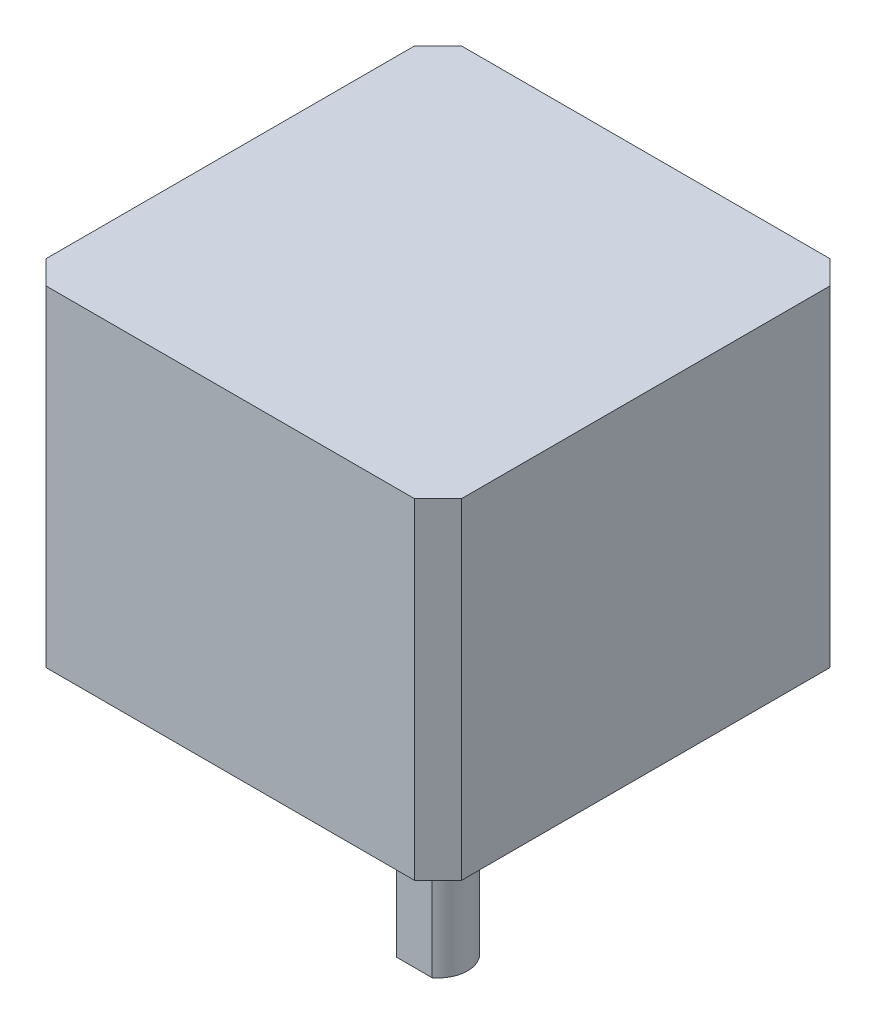
ISO-10303-21;
HEADER;
FILE_DESCRIPTION(('STEP AP214'),'2;1');
FILE_NAME('part.step','',(''),(''),'','','');
FILE_SCHEMA(('AUTOMOTIVE_DESIGN { 1 0 10303 214 1 1 1 1 }'));
ENDSEC;
DATA;
#1=APPLICATION_CONTEXT('core data for automotive mechanical design processes');
#2=APPLICATION_PROTOCOL_DEFINITION('international standard','automotive_design',2000,#1);
#3=PRODUCT_CONTEXT('',#1,'mechanical');
#4=PRODUCT('Part','Part','',(#3));
#5=PRODUCT_RELATED_PRODUCT_CATEGORY('part','',(#4));
#6=PRODUCT_DEFINITION_FORMATION('','',#4);
#7=PRODUCT_DEFINITION_CONTEXT('part definition',#1,'design');
#8=PRODUCT_DEFINITION('design','',#6,#7);
#9=PRODUCT_DEFINITION_SHAPE('','',#8);
#10=(LENGTH_UNIT() NAMED_UNIT(*) SI_UNIT(.MILLI.,.METRE.));
#11=(NAMED_UNIT(*) PLANE_ANGLE_UNIT() SI_UNIT($,.RADIAN.));
#12=(NAMED_UNIT(*) SI_UNIT($,.STERADIAN.) SOLID_ANGLE_UNIT());
#13=UNCERTAINTY_MEASURE_WITH_UNIT(LENGTH_MEASURE(1.E-05),#10,'distance_accuracy_value','');
#14=(GEOMETRIC_REPRESENTATION_CONTEXT(3) GLOBAL_UNCERTAINTY_ASSIGNED_CONTEXT((#13)) GLOBAL_UNIT_ASSIGNED_CONTEXT((#10,
#11,#12)) REPRESENTATION_CONTEXT('',''));
#15=CARTESIAN_POINT('',(0.,0.,0.));
#16=DIRECTION('',(0.,0.,1.));
#17=DIRECTION('',(1.,0.,0.));
#18=AXIS2_PLACEMENT_3D('',#15,#16,#17);
#19=CARTESIAN_POINT('',(-17.6,28.,-15.6));
#20=DIRECTION('',(0.707106781186548,0.,0.707106781186548));
#21=DIRECTION('',(0.,-1.,0.));
#22=AXIS2_PLACEMENT_3D('',#19,#20,#21);
#23=PLANE('',#22);
#24=DIRECTION('',(0.,-1.,0.));
#25=VECTOR('',#24,1.);
#26=CARTESIAN_POINT('',(-17.6,28.,-15.6));
#27=LINE('',#26,#25);
#28=CARTESIAN_POINT('',(-17.6,28.,-15.6));
#29=VERTEX_POINT('',#28);
#30=CARTESIAN_POINT('',(-17.6,0.,-15.6));
#31=VERTEX_POINT('',#30);
#32=EDGE_CURVE('E205',#29,#31,#27,.T.);
#33=ORIENTED_EDGE('',*,*,#32,.F.);
#34=DIRECTION('',(0.707106781186548,0.,-0.707106781186548));
#35=VECTOR('',#34,1.);
#36=CARTESIAN_POINT('',(-16.6,28.,-16.6));
#37=LINE('',#36,#35);
#38=CARTESIAN_POINT('',(-15.6,28.,-17.6));
#39=VERTEX_POINT('',#38);
#40=EDGE_CURVE('E50',#39,#29,#37,.F.);
#41=ORIENTED_EDGE('',*,*,#40,.F.);
#42=DIRECTION('',(0.,1.,0.));
#43=VECTOR('',#42,1.);
#44=CARTESIAN_POINT('',(-15.6,28.,-17.6));
#45=LINE('',#44,#43);
#46=CARTESIAN_POINT('',(-15.6,0.,-17.6));
#47=VERTEX_POINT('',#46);
#48=EDGE_CURVE('E208',#47,#39,#45,.T.);
#49=ORIENTED_EDGE('',*,*,#48,.F.);
#50=DIRECTION('',(-0.707106781186548,0.,0.707106781186548));
#51=VECTOR('',#50,1.);
#52=CARTESIAN_POINT('',(-17.6,0.,-15.6));
#53=LINE('',#52,#51);
#54=EDGE_CURVE('E13',#31,#47,#53,.F.);
#55=ORIENTED_EDGE('',*,*,#54,.F.);
#56=EDGE_LOOP('',(#33,#41,#49,#55));
#57=FACE_BOUND('',#56,.T.);
#58=ADVANCED_FACE('F43',(#57),#23,.F.);
#59=CARTESIAN_POINT('',(17.6,28.,-15.6));
#60=DIRECTION('',(-0.707106781186547,0.,0.707106781186548));
#61=DIRECTION('',(0.,1.,0.));
#62=AXIS2_PLACEMENT_3D('',#59,#60,#61);
#63=PLANE('',#62);
#64=DIRECTION('',(0.,1.,0.));
#65=VECTOR('',#64,1.);
#66=CARTESIAN_POINT('',(17.6,28.,-15.6));
#67=LINE('',#66,#65);
#68=CARTESIAN_POINT('',(17.6,0.,-15.6));
#69=VERTEX_POINT('',#68);
#70=CARTESIAN_POINT('',(17.6,28.,-15.6));
#71=VERTEX_POINT('',#70);
#72=EDGE_CURVE('E195',#69,#71,#67,.T.);
#73=ORIENTED_EDGE('',*,*,#72,.F.);
#74=DIRECTION('',(-0.707106781186548,0.,-0.707106781186547));
#75=VECTOR('',#74,1.);
#76=CARTESIAN_POINT('',(17.6,0.,-15.6));
#77=LINE('',#76,#75);
#78=CARTESIAN_POINT('',(15.6,0.,-17.6));
#79=VERTEX_POINT('',#78);
#80=EDGE_CURVE('E201',#79,#69,#77,.F.);
#81=ORIENTED_EDGE('',*,*,#80,.F.);
#82=DIRECTION('',(0.,-1.,0.));
#83=VECTOR('',#82,1.);
#84=CARTESIAN_POINT('',(15.6,28.,-17.6));
#85=LINE('',#84,#83);
#86=CARTESIAN_POINT('',(15.6,28.,-17.6));
#87=VERTEX_POINT('',#86);
#88=EDGE_CURVE('E198',#87,#79,#85,.T.);
#89=ORIENTED_EDGE('',*,*,#88,.F.);
#90=DIRECTION('',(0.707106781186548,0.,0.707106781186547));
#91=VECTOR('',#90,1.);
#92=CARTESIAN_POINT('',(16.6,28.,-16.6));
#93=LINE('',#92,#91);
#94=EDGE_CURVE('E203',#71,#87,#93,.F.);
#95=ORIENTED_EDGE('',*,*,#94,.F.);
#96=EDGE_LOOP('',(#73,#81,#89,#95));
#97=FACE_BOUND('',#96,.T.);
#98=ADVANCED_FACE('F235',(#97),#63,.F.);
#99=CARTESIAN_POINT('',(17.6,28.,15.6));
#100=DIRECTION('',(-0.707106781186546,0.,-0.707106781186549));
#101=DIRECTION('',(0.,-1.,0.));
#102=AXIS2_PLACEMENT_3D('',#99,#100,#101);
#103=PLANE('',#102);
#104=DIRECTION('',(0.,-1.,0.));
#105=VECTOR('',#104,1.);
#106=CARTESIAN_POINT('',(17.6,28.,15.6));
#107=LINE('',#106,#105);
#108=CARTESIAN_POINT('',(17.6,28.,15.6));
#109=VERTEX_POINT('',#108);
#110=CARTESIAN_POINT('',(17.6,0.,15.6));
#111=VERTEX_POINT('',#110);
#112=EDGE_CURVE('E185',#109,#111,#107,.T.);
#113=ORIENTED_EDGE('',*,*,#112,.F.);
#114=DIRECTION('',(-0.707106781186549,0.,0.707106781186546));
#115=VECTOR('',#114,1.);
#116=CARTESIAN_POINT('',(16.6,28.,16.6));
#117=LINE('',#116,#115);
#118=CARTESIAN_POINT('',(15.6,28.,17.6));
#119=VERTEX_POINT('',#118);
#120=EDGE_CURVE('E191',#119,#109,#117,.F.);
#121=ORIENTED_EDGE('',*,*,#120,.F.);
#122=DIRECTION('',(0.,1.,0.));
#123=VECTOR('',#122,1.);
#124=CARTESIAN_POINT('',(15.6,28.,17.6));
#125=LINE('',#124,#123);
#126=CARTESIAN_POINT('',(15.6,0.,17.6));
#127=VERTEX_POINT('',#126);
#128=EDGE_CURVE('E188',#127,#119,#125,.T.);
#129=ORIENTED_EDGE('',*,*,#128,.F.);
#130=DIRECTION('',(0.707106781186549,0.,-0.707106781186546));
#131=VECTOR('',#130,1.);
#132=CARTESIAN_POINT('',(17.6,0.,15.6));
#133=LINE('',#132,#131);
#134=EDGE_CURVE('E193',#111,#127,#133,.F.);
#135=ORIENTED_EDGE('',*,*,#134,.F.);
#136=EDGE_LOOP('',(#113,#121,#129,#135));
#137=FACE_BOUND('',#136,.T.);
#138=ADVANCED_FACE('F227',(#137),#103,.F.);
#139=CARTESIAN_POINT('',(-15.6,28.,17.6));
#140=DIRECTION('',(0.707106781186548,0.,-0.707106781186547));
#141=DIRECTION('',(0.,-1.,0.));
#142=AXIS2_PLACEMENT_3D('',#139,#140,#141);
#143=PLANE('',#142);
#144=DIRECTION('',(0.,-1.,0.));
#145=VECTOR('',#144,1.);
#146=CARTESIAN_POINT('',(-15.6,28.,17.6));
#147=LINE('',#146,#145);
#148=CARTESIAN_POINT('',(-15.6,28.,17.6));
#149=VERTEX_POINT('',#148);
#150=CARTESIAN_POINT('',(-15.6,0.,17.6));
#151=VERTEX_POINT('',#150);
#152=EDGE_CURVE('E174',#149,#151,#147,.T.);
#153=ORIENTED_EDGE('',*,*,#152,.F.);
#154=DIRECTION('',(-0.707106781186547,0.,-0.707106781186548));
#155=VECTOR('',#154,1.);
#156=CARTESIAN_POINT('',(-16.6,28.,16.6));
#157=LINE('',#156,#155);
#158=CARTESIAN_POINT('',(-17.6,28.,15.6));
#159=VERTEX_POINT('',#158);
#160=EDGE_CURVE('E180',#159,#149,#157,.F.);
#161=ORIENTED_EDGE('',*,*,#160,.F.);
#162=DIRECTION('',(0.,1.,0.));
#163=VECTOR('',#162,1.);
#164=CARTESIAN_POINT('',(-17.6,28.,15.6));
#165=LINE('',#164,#163);
#166=CARTESIAN_POINT('',(-17.6,0.,15.6));
#167=VERTEX_POINT('',#166);
#168=EDGE_CURVE('E177',#167,#159,#165,.T.);
#169=ORIENTED_EDGE('',*,*,#168,.F.);
#170=DIRECTION('',(0.707106781186547,0.,0.707106781186548));
#171=VECTOR('',#170,1.);
#172=CARTESIAN_POINT('',(-15.6,0.,17.6));
#173=LINE('',#172,#171);
#174=EDGE_CURVE('E182',#151,#167,#173,.F.);
#175=ORIENTED_EDGE('',*,*,#174,.F.);
#176=EDGE_LOOP('',(#153,#161,#169,#175));
#177=FACE_BOUND('',#176,.T.);
#178=ADVANCED_FACE('F219',(#177),#143,.F.);
#179=CARTESIAN_POINT('',(-17.6,28.,-17.6));
#180=DIRECTION('',(1.,0.,0.));
#181=DIRECTION('',(0.,0.,-1.));
#182=AXIS2_PLACEMENT_3D('',#179,#180,#181);
#183=PLANE('',#182);
#184=DIRECTION('',(0.,0.,1.));
#185=VECTOR('',#184,1.);
#186=CARTESIAN_POINT('',(-17.6,28.,-17.6));
#187=LINE('',#186,#185);
#188=EDGE_CURVE('E153',#29,#159,#187,.T.);
#189=ORIENTED_EDGE('',*,*,#188,.F.);
#190=ORIENTED_EDGE('',*,*,#32,.T.);
#191=DIRECTION('',(0.,0.,1.));
#192=VECTOR('',#191,1.);
#193=CARTESIAN_POINT('',(-17.6,0.,-17.6));
#194=LINE('',#193,#192);
#195=EDGE_CURVE('E149',#31,#167,#194,.T.);
#196=ORIENTED_EDGE('',*,*,#195,.T.);
#197=ORIENTED_EDGE('',*,*,#168,.T.);
#198=EDGE_LOOP('',(#189,#190,#196,#197));
#199=FACE_BOUND('',#198,.T.);
#200=ADVANCED_FACE('F215',(#199),#183,.F.);
#201=CARTESIAN_POINT('',(-17.6,28.,17.6));
#202=DIRECTION('',(0.,0.,-1.));
#203=DIRECTION('',(-1.,0.,0.));
#204=AXIS2_PLACEMENT_3D('',#201,#202,#203);
#205=PLANE('',#204);
#206=DIRECTION('',(1.,0.,0.));
#207=VECTOR('',#206,1.);
#208=CARTESIAN_POINT('',(-17.6,0.,17.6));
#209=LINE('',#208,#207);
#210=EDGE_CURVE('E165',#151,#127,#209,.T.);
#211=ORIENTED_EDGE('',*,*,#210,.T.);
#212=ORIENTED_EDGE('',*,*,#128,.T.);
#213=DIRECTION('',(1.,0.,0.));
#214=VECTOR('',#213,1.);
#215=CARTESIAN_POINT('',(-17.6,28.,17.6));
#216=LINE('',#215,#214);
#217=EDGE_CURVE('E155',#149,#119,#216,.T.);
#218=ORIENTED_EDGE('',*,*,#217,.F.);
#219=ORIENTED_EDGE('',*,*,#152,.T.);
#220=EDGE_LOOP('',(#211,#212,#218,#219));
#221=FACE_BOUND('',#220,.T.);
#222=ADVANCED_FACE('F223',(#221),#205,.F.);
#223=CARTESIAN_POINT('',(17.6,28.,-17.6));
#224=DIRECTION('',(-1.,0.,0.));
#225=DIRECTION('',(0.,0.,1.));
#226=AXIS2_PLACEMENT_3D('',#223,#224,#225);
#227=PLANE('',#226);
#228=DIRECTION('',(0.,0.,-1.));
#229=VECTOR('',#228,1.);
#230=CARTESIAN_POINT('',(17.6,0.,-17.6));
#231=LINE('',#230,#229);
#232=EDGE_CURVE('E168',#111,#69,#231,.T.);
#233=ORIENTED_EDGE('',*,*,#232,.T.);
#234=ORIENTED_EDGE('',*,*,#72,.T.);
#235=DIRECTION('',(0.,0.,-1.));
#236=VECTOR('',#235,1.);
#237=CARTESIAN_POINT('',(17.6,28.,-17.6));
#238=LINE('',#237,#236);
#239=EDGE_CURVE('E159',#109,#71,#238,.T.);
#240=ORIENTED_EDGE('',*,*,#239,.F.);
#241=ORIENTED_EDGE('',*,*,#112,.T.);
#242=EDGE_LOOP('',(#233,#234,#240,#241));
#243=FACE_BOUND('',#242,.T.);
#244=ADVANCED_FACE('F231',(#243),#227,.F.);
#245=CARTESIAN_POINT('',(-17.6,28.,-17.6));
#246=DIRECTION('',(0.,0.,1.));
#247=DIRECTION('',(1.,0.,0.));
#248=AXIS2_PLACEMENT_3D('',#245,#246,#247);
#249=PLANE('',#248);
#250=DIRECTION('',(-1.,0.,0.));
#251=VECTOR('',#250,1.);
#252=CARTESIAN_POINT('',(-17.6,0.,-17.6));
#253=LINE('',#252,#251);
#254=EDGE_CURVE('E156',#79,#47,#253,.T.);
#255=ORIENTED_EDGE('',*,*,#254,.T.);
#256=ORIENTED_EDGE('',*,*,#48,.T.);
#257=DIRECTION('',(-1.,0.,0.));
#258=VECTOR('',#257,1.);
#259=CARTESIAN_POINT('',(-17.6,28.,-17.6));
#260=LINE('',#259,#258);
#261=EDGE_CURVE('E152',#87,#39,#260,.T.);
#262=ORIENTED_EDGE('',*,*,#261,.F.);
#263=ORIENTED_EDGE('',*,*,#88,.T.);
#264=EDGE_LOOP('',(#255,#256,#262,#263));
#265=FACE_BOUND('',#264,.T.);
#266=ADVANCED_FACE('F237',(#265),#249,.F.);
#267=CARTESIAN_POINT('',(0.,28.,0.));
#268=DIRECTION('',(0.,1.,0.));
#269=DIRECTION('',(0.,0.,1.));
#270=AXIS2_PLACEMENT_3D('',#267,#268,#269);
#271=PLANE('',#270);
#272=ORIENTED_EDGE('',*,*,#261,.T.);
#273=ORIENTED_EDGE('',*,*,#40,.T.);
#274=ORIENTED_EDGE('',*,*,#188,.T.);
#275=ORIENTED_EDGE('',*,*,#160,.T.);
#276=ORIENTED_EDGE('',*,*,#217,.T.);
#277=ORIENTED_EDGE('',*,*,#120,.T.);
#278=ORIENTED_EDGE('',*,*,#239,.T.);
#279=ORIENTED_EDGE('',*,*,#94,.T.);
#280=EDGE_LOOP('',(#272,#273,#274,#275,#276,#277,#278,#279));
#281=FACE_BOUND('',#280,.T.);
#282=ADVANCED_FACE('F210',(#281),#271,.T.);
#283=CARTESIAN_POINT('',(0.,0.,0.));
#284=DIRECTION('',(0.,1.,0.));
#285=DIRECTION('',(0.,0.,1.));
#286=AXIS2_PLACEMENT_3D('',#283,#284,#285);
#287=PLANE('',#286);
#288=CARTESIAN_POINT('',(13.,0.,13.));
#289=DIRECTION('',(0.,-1.,0.));
#290=DIRECTION('',(0.,0.,-1.));
#291=AXIS2_PLACEMENT_3D('',#288,#289,#290);
#292=CIRCLE('',#291,1.5);
#293=CARTESIAN_POINT('',(13.,0.,11.5));
#294=VERTEX_POINT('',#293);
#295=EDGE_CURVE('E462',#294,#294,#292,.T.);
#296=ORIENTED_EDGE('',*,*,#295,.F.);
#297=EDGE_LOOP('',(#296));
#298=FACE_BOUND('',#297,.T.);
#299=CARTESIAN_POINT('',(-12.9999999999993,0.,-13.0000000000007));
#300=DIRECTION('',(0.,-1.,0.));
#301=DIRECTION('',(0.,0.,-1.));
#302=AXIS2_PLACEMENT_3D('',#299,#300,#301);
#303=CIRCLE('',#302,1.50000000000053);
#304=CARTESIAN_POINT('',(-12.9999999999993,0.,-14.5000000000013));
#305=VERTEX_POINT('',#304);
#306=EDGE_CURVE('E474',#305,#305,#303,.T.);
#307=ORIENTED_EDGE('',*,*,#306,.F.);
#308=EDGE_LOOP('',(#307));
#309=FACE_BOUND('',#308,.T.);
#310=CARTESIAN_POINT('',(-13.,0.,12.9999999999993));
#311=DIRECTION('',(0.,-1.,0.));
#312=DIRECTION('',(0.,0.,-1.));
#313=AXIS2_PLACEMENT_3D('',#310,#311,#312);
#314=CIRCLE('',#313,1.50000000000078);
#315=CARTESIAN_POINT('',(-13.,0.,11.4999999999985));
#316=VERTEX_POINT('',#315);
#317=EDGE_CURVE('E469',#316,#316,#314,.T.);
#318=ORIENTED_EDGE('',*,*,#317,.F.);
#319=EDGE_LOOP('',(#318));
#320=FACE_BOUND('',#319,.T.);
#321=CARTESIAN_POINT('',(13.0000000000007,0.,-13.));
#322=DIRECTION('',(0.,-1.,0.));
#323=DIRECTION('',(0.,0.,-1.));
#324=AXIS2_PLACEMENT_3D('',#321,#322,#323);
#325=CIRCLE('',#324,1.49999999999981);
#326=CARTESIAN_POINT('',(13.0000000000007,0.,-14.4999999999998));
#327=VERTEX_POINT('',#326);
#328=EDGE_CURVE('E461',#327,#327,#325,.T.);
#329=ORIENTED_EDGE('',*,*,#328,.F.);
#330=EDGE_LOOP('',(#329));
#331=FACE_BOUND('',#330,.T.);
#332=CARTESIAN_POINT('',(0.,0.,0.));
#333=DIRECTION('',(0.,-1.,0.));
#334=DIRECTION('',(0.,0.,-1.));
#335=AXIS2_PLACEMENT_3D('',#332,#333,#334);
#336=CIRCLE('',#335,11.);
#337=CARTESIAN_POINT('',(0.,0.,-11.));
#338=VERTEX_POINT('',#337);
#339=EDGE_CURVE('E146',#338,#338,#336,.T.);
#340=ORIENTED_EDGE('',*,*,#339,.F.);
#341=EDGE_LOOP('',(#340));
#342=FACE_BOUND('',#341,.T.);
#343=ORIENTED_EDGE('',*,*,#195,.F.);
#344=ORIENTED_EDGE('',*,*,#54,.T.);
#345=ORIENTED_EDGE('',*,*,#254,.F.);
#346=ORIENTED_EDGE('',*,*,#80,.T.);
#347=ORIENTED_EDGE('',*,*,#232,.F.);
#348=ORIENTED_EDGE('',*,*,#134,.T.);
#349=ORIENTED_EDGE('',*,*,#210,.F.);
#350=ORIENTED_EDGE('',*,*,#174,.T.);
#351=EDGE_LOOP('',(#343,#344,#345,#346,#347,#348,#349,#350));
#352=FACE_BOUND('',#351,.T.);
#353=ADVANCED_FACE('F238',(#298,#309,#320,#331,#342,#352),#287,.F.);
#354=CARTESIAN_POINT('',(0.,-2.,0.));
#355=DIRECTION('',(0.,1.,0.));
#356=DIRECTION('',(0.,0.,1.));
#357=AXIS2_PLACEMENT_3D('',#354,#355,#356);
#358=CYLINDRICAL_SURFACE('',#357,11.);
#359=CARTESIAN_POINT('',(0.,-2.,0.));
#360=DIRECTION('',(0.,-1.,0.));
#361=DIRECTION('',(0.,0.,-1.));
#362=AXIS2_PLACEMENT_3D('',#359,#360,#361);
#363=CIRCLE('',#362,11.);
#364=CARTESIAN_POINT('',(0.,-2.,-11.));
#365=VERTEX_POINT('',#364);
#366=EDGE_CURVE('E142',#365,#365,#363,.T.);
#367=ORIENTED_EDGE('',*,*,#366,.F.);
#368=EDGE_LOOP('',(#367));
#369=FACE_BOUND('',#368,.T.);
#370=ORIENTED_EDGE('',*,*,#339,.T.);
#371=EDGE_LOOP('',(#370));
#372=FACE_BOUND('',#371,.T.);
#373=ADVANCED_FACE('F240',(#369,#372),#358,.T.);
#374=CARTESIAN_POINT('',(0.,-2.,0.));
#375=DIRECTION('',(0.,-1.,0.));
#376=DIRECTION('',(0.,0.,-1.));
#377=AXIS2_PLACEMENT_3D('',#374,#375,#376);
#378=PLANE('',#377);
#379=CARTESIAN_POINT('',(0.,-2.,0.));
#380=DIRECTION('',(0.,-1.,0.));
#381=DIRECTION('',(0.,0.,-1.));
#382=AXIS2_PLACEMENT_3D('',#379,#380,#381);
#383=CIRCLE('',#382,2.5);
#384=CARTESIAN_POINT('',(0.,-2.,-2.5));
#385=VERTEX_POINT('',#384);
#386=EDGE_CURVE('E143',#385,#385,#383,.T.);
#387=ORIENTED_EDGE('',*,*,#386,.F.);
#388=EDGE_LOOP('',(#387));
#389=FACE_BOUND('',#388,.T.);
#390=ORIENTED_EDGE('',*,*,#366,.T.);
#391=EDGE_LOOP('',(#390));
#392=FACE_BOUND('',#391,.T.);
#393=ADVANCED_FACE('F248',(#389,#392),#378,.T.);
#394=CARTESIAN_POINT('',(0.,-11.,0.));
#395=DIRECTION('',(0.,1.,0.));
#396=DIRECTION('',(0.,0.,1.));
#397=AXIS2_PLACEMENT_3D('',#394,#395,#396);
#398=CYLINDRICAL_SURFACE('',#397,2.5);
#399=ORIENTED_EDGE('',*,*,#386,.T.);
#400=EDGE_LOOP('',(#399));
#401=FACE_BOUND('',#400,.T.);
#402=CARTESIAN_POINT('',(0.,-11.,0.));
#403=DIRECTION('',(0.,-1.,0.));
#404=DIRECTION('',(0.,0.,-1.));
#405=AXIS2_PLACEMENT_3D('',#402,#403,#404);
#406=CIRCLE('',#405,2.5);
#407=CARTESIAN_POINT('',(1.5,-11.,2.));
#408=VERTEX_POINT('',#407);
#409=CARTESIAN_POINT('',(-1.5,-11.,2.));
#410=VERTEX_POINT('',#409);
#411=EDGE_CURVE('E139',#408,#410,#406,.T.);
#412=ORIENTED_EDGE('',*,*,#411,.F.);
#413=DIRECTION('',(0.,1.,0.));
#414=VECTOR('',#413,1.);
#415=CARTESIAN_POINT('',(1.5,-22.,2.));
#416=LINE('',#415,#414);
#417=CARTESIAN_POINT('',(1.5,-22.,2.));
#418=VERTEX_POINT('',#417);
#419=EDGE_CURVE('E127',#418,#408,#416,.T.);
#420=ORIENTED_EDGE('',*,*,#419,.F.);
#421=CARTESIAN_POINT('',(0.,-22.,0.));
#422=DIRECTION('',(0.,1.,0.));
#423=DIRECTION('',(0.,0.,1.));
#424=AXIS2_PLACEMENT_3D('',#421,#422,#423);
#425=CIRCLE('',#424,2.5);
#426=CARTESIAN_POINT('',(-1.5,-22.,2.));
#427=VERTEX_POINT('',#426);
#428=EDGE_CURVE('E130',#418,#427,#425,.T.);
#429=ORIENTED_EDGE('',*,*,#428,.T.);
#430=DIRECTION('',(0.,1.,0.));
#431=VECTOR('',#430,1.);
#432=CARTESIAN_POINT('',(-1.5,-22.,2.));
#433=LINE('',#432,#431);
#434=EDGE_CURVE('E118',#427,#410,#433,.T.);
#435=ORIENTED_EDGE('',*,*,#434,.T.);
#436=EDGE_LOOP('',(#412,#420,#429,#435));
#437=FACE_BOUND('',#436,.T.);
#438=ADVANCED_FACE('F131',(#401,#437),#398,.T.);
#439=CARTESIAN_POINT('',(0.,-11.,0.));
#440=DIRECTION('',(0.,-1.,0.));
#441=DIRECTION('',(0.,0.,-1.));
#442=AXIS2_PLACEMENT_3D('',#439,#440,#441);
#443=PLANE('',#442);
#444=DIRECTION('',(-1.,0.,0.));
#445=VECTOR('',#444,1.);
#446=CARTESIAN_POINT('',(0.,-11.,2.));
#447=LINE('',#446,#445);
#448=EDGE_CURVE('E124',#408,#410,#447,.T.);
#449=ORIENTED_EDGE('',*,*,#448,.F.);
#450=ORIENTED_EDGE('',*,*,#411,.T.);
#451=EDGE_LOOP('',(#449,#450));
#452=FACE_BOUND('',#451,.T.);
#453=ADVANCED_FACE('F302',(#452),#443,.T.);
#454=CARTESIAN_POINT('',(-1.5,-22.,2.));
#455=DIRECTION('',(0.,0.,1.));
#456=DIRECTION('',(1.,0.,0.));
#457=AXIS2_PLACEMENT_3D('',#454,#455,#456);
#458=PLANE('',#457);
#459=ORIENTED_EDGE('',*,*,#419,.T.);
#460=ORIENTED_EDGE('',*,*,#448,.T.);
#461=ORIENTED_EDGE('',*,*,#434,.F.);
#462=DIRECTION('',(1.,0.,0.));
#463=VECTOR('',#462,1.);
#464=CARTESIAN_POINT('',(-1.5,-22.,2.));
#465=LINE('',#464,#463);
#466=EDGE_CURVE('E123',#427,#418,#465,.T.);
#467=ORIENTED_EDGE('',*,*,#466,.T.);
#468=EDGE_LOOP('',(#459,#460,#461,#467));
#469=FACE_BOUND('',#468,.T.);
#470=ADVANCED_FACE('F121',(#469),#458,.T.);
#471=CARTESIAN_POINT('',(0.,-22.,0.));
#472=DIRECTION('',(0.,1.,0.));
#473=DIRECTION('',(0.,0.,1.));
#474=AXIS2_PLACEMENT_3D('',#471,#472,#473);
#475=PLANE('',#474);
#476=ORIENTED_EDGE('',*,*,#428,.F.);
#477=ORIENTED_EDGE('',*,*,#466,.F.);
#478=EDGE_LOOP('',(#476,#477));
#479=FACE_BOUND('',#478,.T.);
#480=ADVANCED_FACE('F135',(#479),#475,.F.);
#481=CARTESIAN_POINT('',(13.0000000000007,4.,-13.));
#482=DIRECTION('',(0.,-1.,0.));
#483=DIRECTION('',(0.,0.,-1.));
#484=AXIS2_PLACEMENT_3D('',#481,#482,#483);
#485=CYLINDRICAL_SURFACE('',#484,1.49999999999981);
#486=CARTESIAN_POINT('',(13.0000000000007,4.,-13.));
#487=DIRECTION('',(0.,-1.,0.));
#488=DIRECTION('',(0.,0.,-1.));
#489=AXIS2_PLACEMENT_3D('',#486,#487,#488);
#490=CIRCLE('',#489,1.49999999999981);
#491=CARTESIAN_POINT('',(13.0000000000007,4.,-14.4999999999998));
#492=VERTEX_POINT('',#491);
#493=EDGE_CURVE('E133',#492,#492,#490,.T.);
#494=ORIENTED_EDGE('',*,*,#493,.F.);
#495=EDGE_LOOP('',(#494));
#496=FACE_BOUND('',#495,.T.);
#497=ORIENTED_EDGE('',*,*,#328,.T.);
#498=EDGE_LOOP('',(#497));
#499=FACE_BOUND('',#498,.T.);
#500=ADVANCED_FACE('F323',(#496,#499),#485,.F.);
#501=CARTESIAN_POINT('',(13.0000000000007,4.,-13.));
#502=DIRECTION('',(0.,-1.,0.));
#503=DIRECTION('',(0.,0.,-1.));
#504=AXIS2_PLACEMENT_3D('',#501,#502,#503);
#505=PLANE('',#504);
#506=ORIENTED_EDGE('',*,*,#493,.T.);
#507=EDGE_LOOP('',(#506));
#508=FACE_BOUND('',#507,.T.);
#509=ADVANCED_FACE('F330',(#508),#505,.T.);
#510=CARTESIAN_POINT('',(-13.,4.,12.9999999999993));
#511=DIRECTION('',(0.,-1.,0.));
#512=DIRECTION('',(0.,0.,-1.));
#513=AXIS2_PLACEMENT_3D('',#510,#511,#512);
#514=CYLINDRICAL_SURFACE('',#513,1.50000000000078);
#515=CARTESIAN_POINT('',(-13.,4.,12.9999999999993));
#516=DIRECTION('',(0.,-1.,0.));
#517=DIRECTION('',(0.,0.,-1.));
#518=AXIS2_PLACEMENT_3D('',#515,#516,#517);
#519=CIRCLE('',#518,1.50000000000078);
#520=CARTESIAN_POINT('',(-13.,4.,11.4999999999985));
#521=VERTEX_POINT('',#520);
#522=EDGE_CURVE('E477',#521,#521,#519,.T.);
#523=ORIENTED_EDGE('',*,*,#522,.F.);
#524=EDGE_LOOP('',(#523));
#525=FACE_BOUND('',#524,.T.);
#526=ORIENTED_EDGE('',*,*,#317,.T.);
#527=EDGE_LOOP('',(#526));
#528=FACE_BOUND('',#527,.T.);
#529=ADVANCED_FACE('F338',(#525,#528),#514,.F.);
#530=CARTESIAN_POINT('',(-13.,4.,12.9999999999993));
#531=DIRECTION('',(0.,-1.,0.));
#532=DIRECTION('',(0.,0.,-1.));
#533=AXIS2_PLACEMENT_3D('',#530,#531,#532);
#534=PLANE('',#533);
#535=ORIENTED_EDGE('',*,*,#522,.T.);
#536=EDGE_LOOP('',(#535));
#537=FACE_BOUND('',#536,.T.);
#538=ADVANCED_FACE('F346',(#537),#534,.T.);
#539=CARTESIAN_POINT('',(-12.9999999999993,4.,-13.0000000000007));
#540=DIRECTION('',(0.,-1.,0.));
#541=DIRECTION('',(0.,0.,-1.));
#542=AXIS2_PLACEMENT_3D('',#539,#540,#541);
#543=CYLINDRICAL_SURFACE('',#542,1.50000000000053);
#544=CARTESIAN_POINT('',(-12.9999999999993,4.,-13.0000000000007));
#545=DIRECTION('',(0.,-1.,0.));
#546=DIRECTION('',(0.,0.,-1.));
#547=AXIS2_PLACEMENT_3D('',#544,#545,#546);
#548=CIRCLE('',#547,1.50000000000053);
#549=CARTESIAN_POINT('',(-12.9999999999993,4.,-14.5000000000013));
#550=VERTEX_POINT('',#549);
#551=EDGE_CURVE('E466',#550,#550,#548,.T.);
#552=ORIENTED_EDGE('',*,*,#551,.F.);
#553=EDGE_LOOP('',(#552));
#554=FACE_BOUND('',#553,.T.);
#555=ORIENTED_EDGE('',*,*,#306,.T.);
#556=EDGE_LOOP('',(#555));
#557=FACE_BOUND('',#556,.T.);
#558=ADVANCED_FACE('F354',(#554,#557),#543,.F.);
#559=CARTESIAN_POINT('',(-12.9999999999993,4.,-13.0000000000007));
#560=DIRECTION('',(0.,-1.,0.));
#561=DIRECTION('',(0.,0.,-1.));
#562=AXIS2_PLACEMENT_3D('',#559,#560,#561);
#563=PLANE('',#562);
#564=ORIENTED_EDGE('',*,*,#551,.T.);
#565=EDGE_LOOP('',(#564));
#566=FACE_BOUND('',#565,.T.);
#567=ADVANCED_FACE('F362',(#566),#563,.T.);
#568=CARTESIAN_POINT('',(13.,4.,13.));
#569=DIRECTION('',(0.,-1.,0.));
#570=DIRECTION('',(0.,0.,-1.));
#571=AXIS2_PLACEMENT_3D('',#568,#569,#570);
#572=CYLINDRICAL_SURFACE('',#571,1.5);
#573=CARTESIAN_POINT('',(13.,4.,13.));
#574=DIRECTION('',(0.,-1.,0.));
#575=DIRECTION('',(0.,0.,-1.));
#576=AXIS2_PLACEMENT_3D('',#573,#574,#575);
#577=CIRCLE('',#576,1.5);
#578=CARTESIAN_POINT('',(13.,4.,11.5));
#579=VERTEX_POINT('',#578);
#580=EDGE_CURVE('E460',#579,#579,#577,.T.);
#581=ORIENTED_EDGE('',*,*,#580,.F.);
#582=EDGE_LOOP('',(#581));
#583=FACE_BOUND('',#582,.T.);
#584=ORIENTED_EDGE('',*,*,#295,.T.);
#585=EDGE_LOOP('',(#584));
#586=FACE_BOUND('',#585,.T.);
#587=ADVANCED_FACE('F370',(#583,#586),#572,.F.);
#588=CARTESIAN_POINT('',(13.,4.,13.));
#589=DIRECTION('',(0.,-1.,0.));
#590=DIRECTION('',(0.,0.,-1.));
#591=AXIS2_PLACEMENT_3D('',#588,#589,#590);
#592=PLANE('',#591);
#593=ORIENTED_EDGE('',*,*,#580,.T.);
#594=EDGE_LOOP('',(#593));
#595=FACE_BOUND('',#594,.T.);
#596=ADVANCED_FACE('F378',(#595),#592,.T.);
#597=CLOSED_SHELL('',(#58,#98,#138,#178,#200,#222,#244,#266,#282,#353,#373,#393,#438,#453,#470,
#480,#500,#509,#529,#538,#558,#567,#587,#596));
#598=MANIFOLD_SOLID_BREP('B2',#597);
#599=ADVANCED_BREP_SHAPE_REPRESENTATION('',(#18,#598),#14);
#600=SHAPE_DEFINITION_REPRESENTATION(#9,#599);
ENDSEC;
END-ISO-10303-21;
